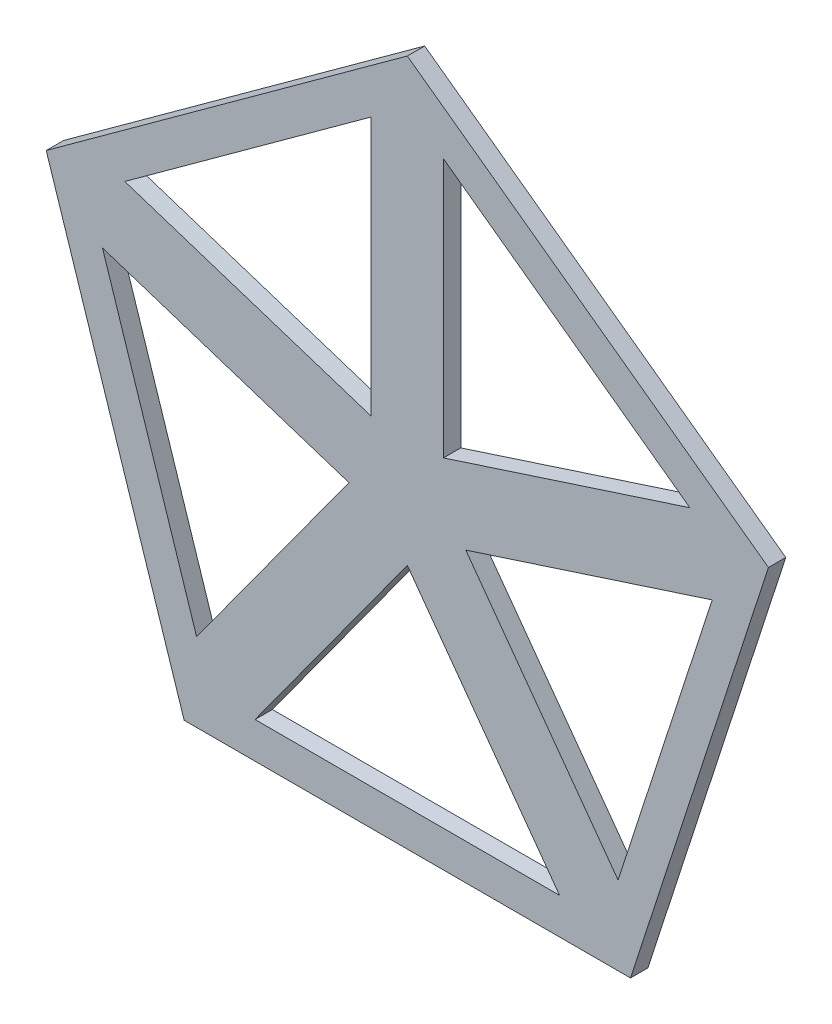
ISO-10303-21;
HEADER;
FILE_DESCRIPTION(('STEP AP214'),'2;1');
FILE_NAME('part.step','',(''),(''),'','','');
FILE_SCHEMA(('AUTOMOTIVE_DESIGN { 1 0 10303 214 1 1 1 1 }'));
ENDSEC;
DATA;
#1=APPLICATION_CONTEXT('core data for automotive mechanical design processes');
#2=APPLICATION_PROTOCOL_DEFINITION('international standard','automotive_design',2000,#1);
#3=PRODUCT_CONTEXT('',#1,'mechanical');
#4=PRODUCT('Part','Part','',(#3));
#5=PRODUCT_RELATED_PRODUCT_CATEGORY('part','',(#4));
#6=PRODUCT_DEFINITION_FORMATION('','',#4);
#7=PRODUCT_DEFINITION_CONTEXT('part definition',#1,'design');
#8=PRODUCT_DEFINITION('design','',#6,#7);
#9=PRODUCT_DEFINITION_SHAPE('','',#8);
#10=(LENGTH_UNIT() NAMED_UNIT(*) SI_UNIT(.MILLI.,.METRE.));
#11=(NAMED_UNIT(*) PLANE_ANGLE_UNIT() SI_UNIT($,.RADIAN.));
#12=(NAMED_UNIT(*) SI_UNIT($,.STERADIAN.) SOLID_ANGLE_UNIT());
#13=UNCERTAINTY_MEASURE_WITH_UNIT(LENGTH_MEASURE(1.E-05),#10,'distance_accuracy_value','');
#14=(GEOMETRIC_REPRESENTATION_CONTEXT(3) GLOBAL_UNCERTAINTY_ASSIGNED_CONTEXT((#13)) GLOBAL_UNIT_ASSIGNED_CONTEXT((#10,
#11,#12)) REPRESENTATION_CONTEXT('',''));
#15=CARTESIAN_POINT('',(0.,0.,0.));
#16=DIRECTION('',(0.,0.,1.));
#17=DIRECTION('',(1.,0.,0.));
#18=AXIS2_PLACEMENT_3D('',#15,#16,#17);
#19=CARTESIAN_POINT('',(0.,0.,1.2));
#20=DIRECTION('',(0.,0.,1.));
#21=DIRECTION('',(1.,0.,0.));
#22=AXIS2_PLACEMENT_3D('',#19,#20,#21);
#23=PLANE('',#22);
#24=DIRECTION('',(-0.587785252292471,-0.809016994374949,0.));
#25=VECTOR('',#24,1.);
#26=CARTESIAN_POINT('',(-10.5443234549845,-18.766270208801,1.2));
#27=LINE('',#26,#25);
#28=CARTESIAN_POINT('',(0.,-4.2532540417602,1.2));
#29=VERTEX_POINT('',#28);
#30=CARTESIAN_POINT('',(-10.5443234549845,-18.766270208801,1.2));
#31=VERTEX_POINT('',#30);
#32=EDGE_CURVE('E199',#29,#31,#27,.T.);
#33=ORIENTED_EDGE('',*,*,#32,.F.);
#34=DIRECTION('',(-0.587785252292474,0.809016994374946,0.));
#35=VECTOR('',#34,1.);
#36=CARTESIAN_POINT('',(10.5443234549845,-18.766270208801,1.2));
#37=LINE('',#36,#35);
#38=CARTESIAN_POINT('',(10.5443234549845,-18.766270208801,1.2));
#39=VERTEX_POINT('',#38);
#40=EDGE_CURVE('E197',#39,#29,#37,.T.);
#41=ORIENTED_EDGE('',*,*,#40,.F.);
#42=DIRECTION('',(1.,0.,0.));
#43=VECTOR('',#42,1.);
#44=CARTESIAN_POINT('',(-10.5443234549845,-18.766270208801,1.2));
#45=LINE('',#44,#43);
#46=EDGE_CURVE('E203',#31,#39,#45,.T.);
#47=ORIENTED_EDGE('',*,*,#46,.F.);
#48=EDGE_LOOP('',(#33,#41,#47));
#49=FACE_BOUND('',#48,.T.);
#50=DIRECTION('',(-0.951056516295154,0.309016994374946,0.));
#51=VECTOR('',#50,1.);
#52=CARTESIAN_POINT('',(-21.1061587104124,4.229151116235,1.2));
#53=LINE('',#52,#51);
#54=CARTESIAN_POINT('',(-4.04508497187473,-1.31432778029784,1.2));
#55=VERTEX_POINT('',#54);
#56=CARTESIAN_POINT('',(-21.1061587104124,4.22915111623499,1.2));
#57=VERTEX_POINT('',#56);
#58=EDGE_CURVE('E247',#55,#57,#53,.T.);
#59=ORIENTED_EDGE('',*,*,#58,.F.);
#60=DIRECTION('',(0.587785252292472,0.809016994374949,0.));
#61=VECTOR('',#60,1.);
#62=CARTESIAN_POINT('',(-14.5894084268592,-15.8273439473387,1.2));
#63=LINE('',#62,#61);
#64=CARTESIAN_POINT('',(-14.5894084268592,-15.8273439473387,1.2));
#65=VERTEX_POINT('',#64);
#66=EDGE_CURVE('E245',#65,#55,#63,.T.);
#67=ORIENTED_EDGE('',*,*,#66,.F.);
#68=DIRECTION('',(0.309016994374949,-0.951056516295153,0.));
#69=VECTOR('',#68,1.);
#70=CARTESIAN_POINT('',(-21.1061587104124,4.229151116235,1.2));
#71=LINE('',#70,#69);
#72=EDGE_CURVE('E251',#57,#65,#71,.T.);
#73=ORIENTED_EDGE('',*,*,#72,.F.);
#74=EDGE_LOOP('',(#59,#67,#73));
#75=FACE_BOUND('',#74,.T.);
#76=DIRECTION('',(-0.809016994374949,0.587785252292472,0.));
#77=VECTOR('',#76,1.);
#78=CARTESIAN_POINT('',(25.,8.1229924058227,1.2));
#79=LINE('',#78,#77);
#80=CARTESIAN_POINT('',(25.,8.1229924058227,1.2));
#81=VERTEX_POINT('',#80);
#82=CARTESIAN_POINT('',(0.,26.2865556059567,1.2));
#83=VERTEX_POINT('',#82);
#84=EDGE_CURVE('E293',#81,#83,#79,.T.);
#85=ORIENTED_EDGE('',*,*,#84,.T.);
#86=DIRECTION('',(-0.809016994374946,-0.587785252292474,0.));
#87=VECTOR('',#86,1.);
#88=CARTESIAN_POINT('',(0.,26.2865556059567,1.2));
#89=LINE('',#88,#87);
#90=CARTESIAN_POINT('',(-25.,8.12299240582262,1.2));
#91=VERTEX_POINT('',#90);
#92=EDGE_CURVE('E296',#83,#91,#89,.T.);
#93=ORIENTED_EDGE('',*,*,#92,.T.);
#94=DIRECTION('',(0.309016994374949,-0.951056516295153,0.));
#95=VECTOR('',#94,1.);
#96=CARTESIAN_POINT('',(-25.,8.12299240582262,1.2));
#97=LINE('',#96,#95);
#98=CARTESIAN_POINT('',(-15.4508497187473,-21.266270208801,1.2));
#99=VERTEX_POINT('',#98);
#100=EDGE_CURVE('E299',#91,#99,#97,.T.);
#101=ORIENTED_EDGE('',*,*,#100,.T.);
#102=DIRECTION('',(1.,0.,0.));
#103=VECTOR('',#102,1.);
#104=CARTESIAN_POINT('',(-15.4508497187473,-21.266270208801,1.2));
#105=LINE('',#104,#103);
#106=CARTESIAN_POINT('',(15.4508497187474,-21.266270208801,1.2));
#107=VERTEX_POINT('',#106);
#108=EDGE_CURVE('E301',#99,#107,#105,.T.);
#109=ORIENTED_EDGE('',*,*,#108,.T.);
#110=DIRECTION('',(0.309016994374946,0.951056516295154,0.));
#111=VECTOR('',#110,1.);
#112=CARTESIAN_POINT('',(15.4508497187474,-21.266270208801,1.2));
#113=LINE('',#112,#111);
#114=EDGE_CURVE('E303',#107,#81,#113,.T.);
#115=ORIENTED_EDGE('',*,*,#114,.T.);
#116=EDGE_LOOP('',(#85,#93,#101,#109,#115));
#117=FACE_BOUND('',#116,.T.);
#118=DIRECTION('',(-0.809016994374946,-0.587785252292474,0.));
#119=VECTOR('',#118,1.);
#120=CARTESIAN_POINT('',(-2.50000000000004,21.3800293421938,1.2));
#121=LINE('',#120,#119);
#122=CARTESIAN_POINT('',(-2.50000000000004,21.3800293421938,1.2));
#123=VERTEX_POINT('',#122);
#124=CARTESIAN_POINT('',(-19.5610737385376,8.98443369771077,1.2));
#125=VERTEX_POINT('',#124);
#126=EDGE_CURVE('E271',#123,#125,#121,.T.);
#127=ORIENTED_EDGE('',*,*,#126,.F.);
#128=DIRECTION('',(0.,1.,0.));
#129=VECTOR('',#128,1.);
#130=CARTESIAN_POINT('',(-2.50000000000004,21.3800293421938,1.2));
#131=LINE('',#130,#129);
#132=CARTESIAN_POINT('',(-2.50000000000004,3.44095480117794,1.2));
#133=VERTEX_POINT('',#132);
#134=EDGE_CURVE('E269',#133,#123,#131,.T.);
#135=ORIENTED_EDGE('',*,*,#134,.F.);
#136=DIRECTION('',(0.951056516295154,-0.309016994374946,0.));
#137=VECTOR('',#136,1.);
#138=CARTESIAN_POINT('',(-19.5610737385376,8.98443369771077,1.2));
#139=LINE('',#138,#137);
#140=EDGE_CURVE('E275',#125,#133,#139,.T.);
#141=ORIENTED_EDGE('',*,*,#140,.F.);
#142=EDGE_LOOP('',(#127,#135,#141));
#143=FACE_BOUND('',#142,.T.);
#144=DIRECTION('',(0.,-1.,0.));
#145=VECTOR('',#144,1.);
#146=CARTESIAN_POINT('',(2.49999999999995,21.3800293421938,1.2));
#147=LINE('',#146,#145);
#148=CARTESIAN_POINT('',(2.49999999999995,21.3800293421938,1.2));
#149=VERTEX_POINT('',#148);
#150=CARTESIAN_POINT('',(2.49999999999996,3.44095480117793,1.2));
#151=VERTEX_POINT('',#150);
#152=EDGE_CURVE('E223',#149,#151,#147,.T.);
#153=ORIENTED_EDGE('',*,*,#152,.F.);
#154=DIRECTION('',(-0.809016994374948,0.587785252292472,0.));
#155=VECTOR('',#154,1.);
#156=CARTESIAN_POINT('',(19.5610737385376,8.98443369771083,1.2));
#157=LINE('',#156,#155);
#158=CARTESIAN_POINT('',(19.5610737385376,8.98443369771083,1.2));
#159=VERTEX_POINT('',#158);
#160=EDGE_CURVE('E221',#159,#149,#157,.T.);
#161=ORIENTED_EDGE('',*,*,#160,.F.);
#162=DIRECTION('',(0.951056516295153,0.309016994374949,0.));
#163=VECTOR('',#162,1.);
#164=CARTESIAN_POINT('',(19.5610737385376,8.98443369771083,1.2));
#165=LINE('',#164,#163);
#166=EDGE_CURVE('E227',#151,#159,#165,.T.);
#167=ORIENTED_EDGE('',*,*,#166,.F.);
#168=EDGE_LOOP('',(#153,#161,#167));
#169=FACE_BOUND('',#168,.T.);
#170=DIRECTION('',(0.309016994374946,0.951056516295154,0.));
#171=VECTOR('',#170,1.);
#172=CARTESIAN_POINT('',(14.5894084268593,-15.8273439473386,1.2));
#173=LINE('',#172,#171);
#174=CARTESIAN_POINT('',(14.5894084268593,-15.8273439473386,1.2));
#175=VERTEX_POINT('',#174);
#176=CARTESIAN_POINT('',(21.1061587104124,4.22915111623507,1.2));
#177=VERTEX_POINT('',#176);
#178=EDGE_CURVE('E178',#175,#177,#173,.T.);
#179=ORIENTED_EDGE('',*,*,#178,.F.);
#180=DIRECTION('',(0.587785252292475,-0.809016994374946,0.));
#181=VECTOR('',#180,1.);
#182=CARTESIAN_POINT('',(14.5894084268593,-15.8273439473386,1.2));
#183=LINE('',#182,#181);
#184=CARTESIAN_POINT('',(4.04508497187474,-1.31432778029783,1.2));
#185=VERTEX_POINT('',#184);
#186=EDGE_CURVE('E170',#185,#175,#183,.T.);
#187=ORIENTED_EDGE('',*,*,#186,.F.);
#188=DIRECTION('',(-0.951056516295153,-0.309016994374949,0.));
#189=VECTOR('',#188,1.);
#190=CARTESIAN_POINT('',(21.1061587104124,4.22915111623507,1.2));
#191=LINE('',#190,#189);
#192=EDGE_CURVE('E187',#177,#185,#191,.T.);
#193=ORIENTED_EDGE('',*,*,#192,.F.);
#194=EDGE_LOOP('',(#179,#187,#193));
#195=FACE_BOUND('',#194,.T.);
#196=ADVANCED_FACE('F33',(#49,#75,#117,#143,#169,#195),#23,.T.);
#197=CARTESIAN_POINT('',(0.,0.,0.));
#198=DIRECTION('',(0.,0.,1.));
#199=DIRECTION('',(1.,0.,0.));
#200=AXIS2_PLACEMENT_3D('',#197,#198,#199);
#201=PLANE('',#200);
#202=DIRECTION('',(-0.587785252292474,0.809016994374946,0.));
#203=VECTOR('',#202,1.);
#204=CARTESIAN_POINT('',(10.5443234549845,-18.766270208801,0.));
#205=LINE('',#204,#203);
#206=CARTESIAN_POINT('',(10.5443234549845,-18.766270208801,0.));
#207=VERTEX_POINT('',#206);
#208=CARTESIAN_POINT('',(0.,-4.2532540417602,0.));
#209=VERTEX_POINT('',#208);
#210=EDGE_CURVE('E185',#207,#209,#205,.T.);
#211=ORIENTED_EDGE('',*,*,#210,.T.);
#212=DIRECTION('',(-0.587785252292471,-0.809016994374949,0.));
#213=VECTOR('',#212,1.);
#214=CARTESIAN_POINT('',(-10.5443234549845,-18.766270208801,0.));
#215=LINE('',#214,#213);
#216=CARTESIAN_POINT('',(-10.5443234549845,-18.766270208801,0.));
#217=VERTEX_POINT('',#216);
#218=EDGE_CURVE('E208',#209,#217,#215,.T.);
#219=ORIENTED_EDGE('',*,*,#218,.T.);
#220=DIRECTION('',(1.,0.,0.));
#221=VECTOR('',#220,1.);
#222=CARTESIAN_POINT('',(-10.5443234549845,-18.766270208801,0.));
#223=LINE('',#222,#221);
#224=EDGE_CURVE('E200',#217,#207,#223,.T.);
#225=ORIENTED_EDGE('',*,*,#224,.T.);
#226=EDGE_LOOP('',(#211,#219,#225));
#227=FACE_BOUND('',#226,.T.);
#228=DIRECTION('',(0.587785252292472,0.809016994374949,0.));
#229=VECTOR('',#228,1.);
#230=CARTESIAN_POINT('',(-14.5894084268592,-15.8273439473387,0.));
#231=LINE('',#230,#229);
#232=CARTESIAN_POINT('',(-14.5894084268592,-15.8273439473387,0.));
#233=VERTEX_POINT('',#232);
#234=CARTESIAN_POINT('',(-4.04508497187473,-1.31432778029784,0.));
#235=VERTEX_POINT('',#234);
#236=EDGE_CURVE('E244',#233,#235,#231,.T.);
#237=ORIENTED_EDGE('',*,*,#236,.T.);
#238=DIRECTION('',(-0.951056516295154,0.309016994374946,0.));
#239=VECTOR('',#238,1.);
#240=CARTESIAN_POINT('',(-21.1061587104124,4.229151116235,0.));
#241=LINE('',#240,#239);
#242=CARTESIAN_POINT('',(-21.1061587104124,4.229151116235,0.));
#243=VERTEX_POINT('',#242);
#244=EDGE_CURVE('E256',#235,#243,#241,.T.);
#245=ORIENTED_EDGE('',*,*,#244,.T.);
#246=DIRECTION('',(0.309016994374949,-0.951056516295153,0.));
#247=VECTOR('',#246,1.);
#248=CARTESIAN_POINT('',(-21.1061587104124,4.229151116235,0.));
#249=LINE('',#248,#247);
#250=EDGE_CURVE('E248',#243,#233,#249,.T.);
#251=ORIENTED_EDGE('',*,*,#250,.T.);
#252=EDGE_LOOP('',(#237,#245,#251));
#253=FACE_BOUND('',#252,.T.);
#254=DIRECTION('',(-0.809016994374949,0.587785252292472,0.));
#255=VECTOR('',#254,1.);
#256=CARTESIAN_POINT('',(25.,8.1229924058227,0.));
#257=LINE('',#256,#255);
#258=CARTESIAN_POINT('',(25.,8.1229924058227,0.));
#259=VERTEX_POINT('',#258);
#260=CARTESIAN_POINT('',(0.,26.2865556059567,0.));
#261=VERTEX_POINT('',#260);
#262=EDGE_CURVE('E292',#259,#261,#257,.T.);
#263=ORIENTED_EDGE('',*,*,#262,.F.);
#264=DIRECTION('',(0.309016994374946,0.951056516295154,0.));
#265=VECTOR('',#264,1.);
#266=CARTESIAN_POINT('',(15.4508497187474,-21.266270208801,0.));
#267=LINE('',#266,#265);
#268=CARTESIAN_POINT('',(15.4508497187474,-21.266270208801,0.));
#269=VERTEX_POINT('',#268);
#270=EDGE_CURVE('E297',#269,#259,#267,.T.);
#271=ORIENTED_EDGE('',*,*,#270,.F.);
#272=DIRECTION('',(1.,0.,0.));
#273=VECTOR('',#272,1.);
#274=CARTESIAN_POINT('',(-15.4508497187473,-21.266270208801,0.));
#275=LINE('',#274,#273);
#276=CARTESIAN_POINT('',(-15.4508497187473,-21.266270208801,0.));
#277=VERTEX_POINT('',#276);
#278=EDGE_CURVE('E312',#277,#269,#275,.T.);
#279=ORIENTED_EDGE('',*,*,#278,.F.);
#280=DIRECTION('',(0.309016994374949,-0.951056516295153,0.));
#281=VECTOR('',#280,1.);
#282=CARTESIAN_POINT('',(-25.,8.12299240582262,0.));
#283=LINE('',#282,#281);
#284=CARTESIAN_POINT('',(-25.,8.12299240582262,0.));
#285=VERTEX_POINT('',#284);
#286=EDGE_CURVE('E310',#285,#277,#283,.T.);
#287=ORIENTED_EDGE('',*,*,#286,.F.);
#288=DIRECTION('',(-0.809016994374946,-0.587785252292474,0.));
#289=VECTOR('',#288,1.);
#290=CARTESIAN_POINT('',(0.,26.2865556059567,0.));
#291=LINE('',#290,#289);
#292=EDGE_CURVE('E308',#261,#285,#291,.T.);
#293=ORIENTED_EDGE('',*,*,#292,.F.);
#294=EDGE_LOOP('',(#263,#271,#279,#287,#293));
#295=FACE_BOUND('',#294,.T.);
#296=DIRECTION('',(0.,1.,0.));
#297=VECTOR('',#296,1.);
#298=CARTESIAN_POINT('',(-2.50000000000004,21.3800293421938,0.));
#299=LINE('',#298,#297);
#300=CARTESIAN_POINT('',(-2.50000000000004,3.44095480117795,0.));
#301=VERTEX_POINT('',#300);
#302=CARTESIAN_POINT('',(-2.50000000000004,21.3800293421938,0.));
#303=VERTEX_POINT('',#302);
#304=EDGE_CURVE('E268',#301,#303,#299,.T.);
#305=ORIENTED_EDGE('',*,*,#304,.T.);
#306=DIRECTION('',(-0.809016994374946,-0.587785252292474,0.));
#307=VECTOR('',#306,1.);
#308=CARTESIAN_POINT('',(-2.50000000000004,21.3800293421938,0.));
#309=LINE('',#308,#307);
#310=CARTESIAN_POINT('',(-19.5610737385376,8.98443369771077,0.));
#311=VERTEX_POINT('',#310);
#312=EDGE_CURVE('E280',#303,#311,#309,.T.);
#313=ORIENTED_EDGE('',*,*,#312,.T.);
#314=DIRECTION('',(0.951056516295154,-0.309016994374946,0.));
#315=VECTOR('',#314,1.);
#316=CARTESIAN_POINT('',(-19.5610737385376,8.98443369771077,0.));
#317=LINE('',#316,#315);
#318=EDGE_CURVE('E272',#311,#301,#317,.T.);
#319=ORIENTED_EDGE('',*,*,#318,.T.);
#320=EDGE_LOOP('',(#305,#313,#319));
#321=FACE_BOUND('',#320,.T.);
#322=DIRECTION('',(-0.809016994374948,0.587785252292472,0.));
#323=VECTOR('',#322,1.);
#324=CARTESIAN_POINT('',(19.5610737385376,8.98443369771083,0.));
#325=LINE('',#324,#323);
#326=CARTESIAN_POINT('',(19.5610737385376,8.98443369771083,0.));
#327=VERTEX_POINT('',#326);
#328=CARTESIAN_POINT('',(2.49999999999995,21.3800293421938,0.));
#329=VERTEX_POINT('',#328);
#330=EDGE_CURVE('E220',#327,#329,#325,.T.);
#331=ORIENTED_EDGE('',*,*,#330,.T.);
#332=DIRECTION('',(0.,-1.,0.));
#333=VECTOR('',#332,1.);
#334=CARTESIAN_POINT('',(2.49999999999995,21.3800293421938,0.));
#335=LINE('',#334,#333);
#336=CARTESIAN_POINT('',(2.49999999999996,3.44095480117792,0.));
#337=VERTEX_POINT('',#336);
#338=EDGE_CURVE('E232',#329,#337,#335,.T.);
#339=ORIENTED_EDGE('',*,*,#338,.T.);
#340=DIRECTION('',(0.951056516295153,0.309016994374949,0.));
#341=VECTOR('',#340,1.);
#342=CARTESIAN_POINT('',(19.5610737385376,8.98443369771083,0.));
#343=LINE('',#342,#341);
#344=EDGE_CURVE('E224',#337,#327,#343,.T.);
#345=ORIENTED_EDGE('',*,*,#344,.T.);
#346=EDGE_LOOP('',(#331,#339,#345));
#347=FACE_BOUND('',#346,.T.);
#348=DIRECTION('',(0.587785252292475,-0.809016994374946,0.));
#349=VECTOR('',#348,1.);
#350=CARTESIAN_POINT('',(14.5894084268593,-15.8273439473386,0.));
#351=LINE('',#350,#349);
#352=CARTESIAN_POINT('',(4.04508497187474,-1.31432778029783,0.));
#353=VERTEX_POINT('',#352);
#354=CARTESIAN_POINT('',(14.5894084268593,-15.8273439473386,0.));
#355=VERTEX_POINT('',#354);
#356=EDGE_CURVE('E56',#353,#355,#351,.T.);
#357=ORIENTED_EDGE('',*,*,#356,.T.);
#358=DIRECTION('',(0.309016994374946,0.951056516295154,0.));
#359=VECTOR('',#358,1.);
#360=CARTESIAN_POINT('',(14.5894084268593,-15.8273439473386,0.));
#361=LINE('',#360,#359);
#362=CARTESIAN_POINT('',(21.1061587104124,4.22915111623507,0.));
#363=VERTEX_POINT('',#362);
#364=EDGE_CURVE('E184',#355,#363,#361,.T.);
#365=ORIENTED_EDGE('',*,*,#364,.T.);
#366=DIRECTION('',(-0.951056516295153,-0.309016994374949,0.));
#367=VECTOR('',#366,1.);
#368=CARTESIAN_POINT('',(21.1061587104124,4.22915111623507,0.));
#369=LINE('',#368,#367);
#370=EDGE_CURVE('E179',#363,#353,#369,.T.);
#371=ORIENTED_EDGE('',*,*,#370,.T.);
#372=EDGE_LOOP('',(#357,#365,#371));
#373=FACE_BOUND('',#372,.T.);
#374=ADVANCED_FACE('F333',(#227,#253,#295,#321,#347,#373),#201,.F.);
#375=CARTESIAN_POINT('',(25.,8.1229924058227,1.2));
#376=DIRECTION('',(-0.587785252292472,-0.809016994374949,0.));
#377=DIRECTION('',(0.809016994374949,-0.587785252292472,0.));
#378=AXIS2_PLACEMENT_3D('',#375,#376,#377);
#379=PLANE('',#378);
#380=ORIENTED_EDGE('',*,*,#262,.T.);
#381=DIRECTION('',(0.,0.,-1.));
#382=VECTOR('',#381,1.);
#383=CARTESIAN_POINT('',(0.,26.2865556059567,1.2));
#384=LINE('',#383,#382);
#385=EDGE_CURVE('E11',#83,#261,#384,.T.);
#386=ORIENTED_EDGE('',*,*,#385,.F.);
#387=ORIENTED_EDGE('',*,*,#84,.F.);
#388=DIRECTION('',(0.,0.,-1.));
#389=VECTOR('',#388,1.);
#390=CARTESIAN_POINT('',(25.,8.1229924058227,1.2));
#391=LINE('',#390,#389);
#392=EDGE_CURVE('E305',#81,#259,#391,.T.);
#393=ORIENTED_EDGE('',*,*,#392,.T.);
#394=EDGE_LOOP('',(#380,#386,#387,#393));
#395=FACE_BOUND('',#394,.T.);
#396=ADVANCED_FACE('F35',(#395),#379,.F.);
#397=CARTESIAN_POINT('',(0.,26.2865556059567,1.2));
#398=DIRECTION('',(0.587785252292474,-0.809016994374947,0.));
#399=DIRECTION('',(0.809016994374947,0.587785252292474,0.));
#400=AXIS2_PLACEMENT_3D('',#397,#398,#399);
#401=PLANE('',#400);
#402=ORIENTED_EDGE('',*,*,#292,.T.);
#403=DIRECTION('',(0.,0.,-1.));
#404=VECTOR('',#403,1.);
#405=CARTESIAN_POINT('',(-25.,8.12299240582262,1.2));
#406=LINE('',#405,#404);
#407=EDGE_CURVE('E41',#91,#285,#406,.T.);
#408=ORIENTED_EDGE('',*,*,#407,.F.);
#409=ORIENTED_EDGE('',*,*,#92,.F.);
#410=ORIENTED_EDGE('',*,*,#385,.T.);
#411=EDGE_LOOP('',(#402,#408,#409,#410));
#412=FACE_BOUND('',#411,.T.);
#413=ADVANCED_FACE('F348',(#412),#401,.F.);
#414=CARTESIAN_POINT('',(-25.,8.12299240582262,1.2));
#415=DIRECTION('',(0.951056516295153,0.309016994374949,0.));
#416=DIRECTION('',(-0.309016994374949,0.951056516295153,0.));
#417=AXIS2_PLACEMENT_3D('',#414,#415,#416);
#418=PLANE('',#417);
#419=ORIENTED_EDGE('',*,*,#286,.T.);
#420=DIRECTION('',(0.,0.,-1.));
#421=VECTOR('',#420,1.);
#422=CARTESIAN_POINT('',(-15.4508497187473,-21.266270208801,1.2));
#423=LINE('',#422,#421);
#424=EDGE_CURVE('E320',#99,#277,#423,.T.);
#425=ORIENTED_EDGE('',*,*,#424,.F.);
#426=ORIENTED_EDGE('',*,*,#100,.F.);
#427=ORIENTED_EDGE('',*,*,#407,.T.);
#428=EDGE_LOOP('',(#419,#425,#426,#427));
#429=FACE_BOUND('',#428,.T.);
#430=ADVANCED_FACE('F327',(#429),#418,.F.);
#431=CARTESIAN_POINT('',(-15.4508497187473,-21.266270208801,1.2));
#432=DIRECTION('',(0.,1.,0.));
#433=DIRECTION('',(-1.,0.,0.));
#434=AXIS2_PLACEMENT_3D('',#431,#432,#433);
#435=PLANE('',#434);
#436=ORIENTED_EDGE('',*,*,#278,.T.);
#437=DIRECTION('',(0.,0.,-1.));
#438=VECTOR('',#437,1.);
#439=CARTESIAN_POINT('',(15.4508497187474,-21.266270208801,1.2));
#440=LINE('',#439,#438);
#441=EDGE_CURVE('E317',#107,#269,#440,.T.);
#442=ORIENTED_EDGE('',*,*,#441,.F.);
#443=ORIENTED_EDGE('',*,*,#108,.F.);
#444=ORIENTED_EDGE('',*,*,#424,.T.);
#445=EDGE_LOOP('',(#436,#442,#443,#444));
#446=FACE_BOUND('',#445,.T.);
#447=ADVANCED_FACE('F338',(#446),#435,.F.);
#448=CARTESIAN_POINT('',(15.4508497187474,-21.266270208801,1.2));
#449=DIRECTION('',(-0.951056516295154,0.309016994374946,0.));
#450=DIRECTION('',(-0.309016994374946,-0.951056516295154,0.));
#451=AXIS2_PLACEMENT_3D('',#448,#449,#450);
#452=PLANE('',#451);
#453=ORIENTED_EDGE('',*,*,#270,.T.);
#454=ORIENTED_EDGE('',*,*,#392,.F.);
#455=ORIENTED_EDGE('',*,*,#114,.F.);
#456=ORIENTED_EDGE('',*,*,#441,.T.);
#457=EDGE_LOOP('',(#453,#454,#455,#456));
#458=FACE_BOUND('',#457,.T.);
#459=ADVANCED_FACE('F342',(#458),#452,.F.);
#460=CARTESIAN_POINT('',(-2.50000000000004,21.3800293421938,1.2));
#461=DIRECTION('',(-1.,0.,0.));
#462=DIRECTION('',(0.,-1.,0.));
#463=AXIS2_PLACEMENT_3D('',#460,#461,#462);
#464=PLANE('',#463);
#465=ORIENTED_EDGE('',*,*,#304,.F.);
#466=DIRECTION('',(0.,0.,-1.));
#467=VECTOR('',#466,1.);
#468=CARTESIAN_POINT('',(-2.50000000000004,3.44095480117794,1.2));
#469=LINE('',#468,#467);
#470=EDGE_CURVE('E277',#133,#301,#469,.T.);
#471=ORIENTED_EDGE('',*,*,#470,.F.);
#472=ORIENTED_EDGE('',*,*,#134,.T.);
#473=DIRECTION('',(0.,0.,-1.));
#474=VECTOR('',#473,1.);
#475=CARTESIAN_POINT('',(-2.50000000000004,21.3800293421938,1.2));
#476=LINE('',#475,#474);
#477=EDGE_CURVE('E289',#123,#303,#476,.T.);
#478=ORIENTED_EDGE('',*,*,#477,.T.);
#479=EDGE_LOOP('',(#465,#471,#472,#478));
#480=FACE_BOUND('',#479,.T.);
#481=ADVANCED_FACE('F365',(#480),#464,.T.);
#482=CARTESIAN_POINT('',(-2.50000000000004,21.3800293421938,1.2));
#483=DIRECTION('',(0.587785252292474,-0.809016994374946,0.));
#484=DIRECTION('',(0.809016994374947,0.587785252292475,0.));
#485=AXIS2_PLACEMENT_3D('',#482,#483,#484);
#486=PLANE('',#485);
#487=ORIENTED_EDGE('',*,*,#312,.F.);
#488=ORIENTED_EDGE('',*,*,#477,.F.);
#489=ORIENTED_EDGE('',*,*,#126,.T.);
#490=DIRECTION('',(0.,0.,-1.));
#491=VECTOR('',#490,1.);
#492=CARTESIAN_POINT('',(-19.5610737385376,8.98443369771077,1.2));
#493=LINE('',#492,#491);
#494=EDGE_CURVE('E287',#125,#311,#493,.T.);
#495=ORIENTED_EDGE('',*,*,#494,.T.);
#496=EDGE_LOOP('',(#487,#488,#489,#495));
#497=FACE_BOUND('',#496,.T.);
#498=ADVANCED_FACE('F391',(#497),#486,.T.);
#499=CARTESIAN_POINT('',(-19.5610737385376,8.98443369771077,1.2));
#500=DIRECTION('',(0.309016994374946,0.951056516295154,0.));
#501=DIRECTION('',(-0.951056516295154,0.309016994374946,0.));
#502=AXIS2_PLACEMENT_3D('',#499,#500,#501);
#503=PLANE('',#502);
#504=ORIENTED_EDGE('',*,*,#318,.F.);
#505=ORIENTED_EDGE('',*,*,#494,.F.);
#506=ORIENTED_EDGE('',*,*,#140,.T.);
#507=ORIENTED_EDGE('',*,*,#470,.T.);
#508=EDGE_LOOP('',(#504,#505,#506,#507));
#509=FACE_BOUND('',#508,.T.);
#510=ADVANCED_FACE('F398',(#509),#503,.T.);
#511=CARTESIAN_POINT('',(-14.5894084268592,-15.8273439473387,1.2));
#512=DIRECTION('',(-0.809016994374949,0.587785252292472,0.));
#513=DIRECTION('',(-0.587785252292472,-0.809016994374949,0.));
#514=AXIS2_PLACEMENT_3D('',#511,#512,#513);
#515=PLANE('',#514);
#516=ORIENTED_EDGE('',*,*,#236,.F.);
#517=DIRECTION('',(0.,0.,-1.));
#518=VECTOR('',#517,1.);
#519=CARTESIAN_POINT('',(-14.5894084268592,-15.8273439473387,1.2));
#520=LINE('',#519,#518);
#521=EDGE_CURVE('E253',#65,#233,#520,.T.);
#522=ORIENTED_EDGE('',*,*,#521,.F.);
#523=ORIENTED_EDGE('',*,*,#66,.T.);
#524=DIRECTION('',(0.,0.,-1.));
#525=VECTOR('',#524,1.);
#526=CARTESIAN_POINT('',(-4.04508497187473,-1.31432778029784,1.2));
#527=LINE('',#526,#525);
#528=EDGE_CURVE('E265',#55,#235,#527,.T.);
#529=ORIENTED_EDGE('',*,*,#528,.T.);
#530=EDGE_LOOP('',(#516,#522,#523,#529));
#531=FACE_BOUND('',#530,.T.);
#532=ADVANCED_FACE('F405',(#531),#515,.T.);
#533=CARTESIAN_POINT('',(-21.1061587104124,4.229151116235,1.2));
#534=DIRECTION('',(-0.309016994374946,-0.951056516295154,0.));
#535=DIRECTION('',(0.951056516295154,-0.309016994374946,0.));
#536=AXIS2_PLACEMENT_3D('',#533,#534,#535);
#537=PLANE('',#536);
#538=ORIENTED_EDGE('',*,*,#244,.F.);
#539=ORIENTED_EDGE('',*,*,#528,.F.);
#540=ORIENTED_EDGE('',*,*,#58,.T.);
#541=DIRECTION('',(0.,0.,-1.));
#542=VECTOR('',#541,1.);
#543=CARTESIAN_POINT('',(-21.1061587104124,4.229151116235,1.2));
#544=LINE('',#543,#542);
#545=EDGE_CURVE('E263',#57,#243,#544,.T.);
#546=ORIENTED_EDGE('',*,*,#545,.T.);
#547=EDGE_LOOP('',(#538,#539,#540,#546));
#548=FACE_BOUND('',#547,.T.);
#549=ADVANCED_FACE('F413',(#548),#537,.T.);
#550=CARTESIAN_POINT('',(-21.1061587104124,4.229151116235,1.2));
#551=DIRECTION('',(0.951056516295153,0.309016994374949,0.));
#552=DIRECTION('',(-0.309016994374949,0.951056516295153,0.));
#553=AXIS2_PLACEMENT_3D('',#550,#551,#552);
#554=PLANE('',#553);
#555=ORIENTED_EDGE('',*,*,#250,.F.);
#556=ORIENTED_EDGE('',*,*,#545,.F.);
#557=ORIENTED_EDGE('',*,*,#72,.T.);
#558=ORIENTED_EDGE('',*,*,#521,.T.);
#559=EDGE_LOOP('',(#555,#556,#557,#558));
#560=FACE_BOUND('',#559,.T.);
#561=ADVANCED_FACE('F421',(#560),#554,.T.);
#562=CARTESIAN_POINT('',(19.5610737385376,8.98443369771083,1.2));
#563=DIRECTION('',(-0.587785252292472,-0.809016994374948,0.));
#564=DIRECTION('',(0.809016994374948,-0.587785252292472,0.));
#565=AXIS2_PLACEMENT_3D('',#562,#563,#564);
#566=PLANE('',#565);
#567=ORIENTED_EDGE('',*,*,#330,.F.);
#568=DIRECTION('',(0.,0.,-1.));
#569=VECTOR('',#568,1.);
#570=CARTESIAN_POINT('',(19.5610737385376,8.98443369771083,1.2));
#571=LINE('',#570,#569);
#572=EDGE_CURVE('E229',#159,#327,#571,.T.);
#573=ORIENTED_EDGE('',*,*,#572,.F.);
#574=ORIENTED_EDGE('',*,*,#160,.T.);
#575=DIRECTION('',(0.,0.,-1.));
#576=VECTOR('',#575,1.);
#577=CARTESIAN_POINT('',(2.49999999999995,21.3800293421938,1.2));
#578=LINE('',#577,#576);
#579=EDGE_CURVE('E241',#149,#329,#578,.T.);
#580=ORIENTED_EDGE('',*,*,#579,.T.);
#581=EDGE_LOOP('',(#567,#573,#574,#580));
#582=FACE_BOUND('',#581,.T.);
#583=ADVANCED_FACE('F429',(#582),#566,.T.);
#584=CARTESIAN_POINT('',(2.49999999999995,21.3800293421938,1.2));
#585=DIRECTION('',(1.,0.,0.));
#586=DIRECTION('',(0.,1.,0.));
#587=AXIS2_PLACEMENT_3D('',#584,#585,#586);
#588=PLANE('',#587);
#589=ORIENTED_EDGE('',*,*,#338,.F.);
#590=ORIENTED_EDGE('',*,*,#579,.F.);
#591=ORIENTED_EDGE('',*,*,#152,.T.);
#592=DIRECTION('',(0.,0.,-1.));
#593=VECTOR('',#592,1.);
#594=CARTESIAN_POINT('',(2.49999999999996,3.44095480117792,1.2));
#595=LINE('',#594,#593);
#596=EDGE_CURVE('E239',#151,#337,#595,.T.);
#597=ORIENTED_EDGE('',*,*,#596,.T.);
#598=EDGE_LOOP('',(#589,#590,#591,#597));
#599=FACE_BOUND('',#598,.T.);
#600=ADVANCED_FACE('F437',(#599),#588,.T.);
#601=CARTESIAN_POINT('',(19.5610737385376,8.98443369771083,1.2));
#602=DIRECTION('',(-0.309016994374949,0.951056516295153,0.));
#603=DIRECTION('',(-0.951056516295153,-0.309016994374949,0.));
#604=AXIS2_PLACEMENT_3D('',#601,#602,#603);
#605=PLANE('',#604);
#606=ORIENTED_EDGE('',*,*,#344,.F.);
#607=ORIENTED_EDGE('',*,*,#596,.F.);
#608=ORIENTED_EDGE('',*,*,#166,.T.);
#609=ORIENTED_EDGE('',*,*,#572,.T.);
#610=EDGE_LOOP('',(#606,#607,#608,#609));
#611=FACE_BOUND('',#610,.T.);
#612=ADVANCED_FACE('F445',(#611),#605,.T.);
#613=CARTESIAN_POINT('',(10.5443234549845,-18.766270208801,1.2));
#614=DIRECTION('',(-0.809016994374946,-0.587785252292474,0.));
#615=DIRECTION('',(0.587785252292475,-0.809016994374947,0.));
#616=AXIS2_PLACEMENT_3D('',#613,#614,#615);
#617=PLANE('',#616);
#618=ORIENTED_EDGE('',*,*,#210,.F.);
#619=DIRECTION('',(0.,0.,-1.));
#620=VECTOR('',#619,1.);
#621=CARTESIAN_POINT('',(10.5443234549845,-18.766270208801,1.2));
#622=LINE('',#621,#620);
#623=EDGE_CURVE('E205',#39,#207,#622,.T.);
#624=ORIENTED_EDGE('',*,*,#623,.F.);
#625=ORIENTED_EDGE('',*,*,#40,.T.);
#626=DIRECTION('',(0.,0.,-1.));
#627=VECTOR('',#626,1.);
#628=CARTESIAN_POINT('',(0.,-4.2532540417602,1.2));
#629=LINE('',#628,#627);
#630=EDGE_CURVE('E217',#29,#209,#629,.T.);
#631=ORIENTED_EDGE('',*,*,#630,.T.);
#632=EDGE_LOOP('',(#618,#624,#625,#631));
#633=FACE_BOUND('',#632,.T.);
#634=ADVANCED_FACE('F453',(#633),#617,.T.);
#635=CARTESIAN_POINT('',(-10.5443234549845,-18.766270208801,1.2));
#636=DIRECTION('',(0.809016994374949,-0.587785252292471,0.));
#637=DIRECTION('',(0.587785252292471,0.809016994374949,0.));
#638=AXIS2_PLACEMENT_3D('',#635,#636,#637);
#639=PLANE('',#638);
#640=ORIENTED_EDGE('',*,*,#218,.F.);
#641=ORIENTED_EDGE('',*,*,#630,.F.);
#642=ORIENTED_EDGE('',*,*,#32,.T.);
#643=DIRECTION('',(0.,0.,-1.));
#644=VECTOR('',#643,1.);
#645=CARTESIAN_POINT('',(-10.5443234549845,-18.766270208801,1.2));
#646=LINE('',#645,#644);
#647=EDGE_CURVE('E215',#31,#217,#646,.T.);
#648=ORIENTED_EDGE('',*,*,#647,.T.);
#649=EDGE_LOOP('',(#640,#641,#642,#648));
#650=FACE_BOUND('',#649,.T.);
#651=ADVANCED_FACE('F461',(#650),#639,.T.);
#652=CARTESIAN_POINT('',(-10.5443234549845,-18.766270208801,1.2));
#653=DIRECTION('',(0.,1.,0.));
#654=DIRECTION('',(-1.,0.,0.));
#655=AXIS2_PLACEMENT_3D('',#652,#653,#654);
#656=PLANE('',#655);
#657=ORIENTED_EDGE('',*,*,#224,.F.);
#658=ORIENTED_EDGE('',*,*,#647,.F.);
#659=ORIENTED_EDGE('',*,*,#46,.T.);
#660=ORIENTED_EDGE('',*,*,#623,.T.);
#661=EDGE_LOOP('',(#657,#658,#659,#660));
#662=FACE_BOUND('',#661,.T.);
#663=ADVANCED_FACE('F469',(#662),#656,.T.);
#664=CARTESIAN_POINT('',(14.5894084268593,-15.8273439473386,1.2));
#665=DIRECTION('',(0.809016994374946,0.587785252292475,0.));
#666=DIRECTION('',(-0.587785252292475,0.809016994374946,0.));
#667=AXIS2_PLACEMENT_3D('',#664,#665,#666);
#668=PLANE('',#667);
#669=ORIENTED_EDGE('',*,*,#356,.F.);
#670=DIRECTION('',(0.,0.,-1.));
#671=VECTOR('',#670,1.);
#672=CARTESIAN_POINT('',(4.04508497187474,-1.31432778029783,1.2));
#673=LINE('',#672,#671);
#674=EDGE_CURVE('E174',#185,#353,#673,.T.);
#675=ORIENTED_EDGE('',*,*,#674,.F.);
#676=ORIENTED_EDGE('',*,*,#186,.T.);
#677=DIRECTION('',(0.,0.,-1.));
#678=VECTOR('',#677,1.);
#679=CARTESIAN_POINT('',(14.5894084268593,-15.8273439473386,1.2));
#680=LINE('',#679,#678);
#681=EDGE_CURVE('E173',#175,#355,#680,.T.);
#682=ORIENTED_EDGE('',*,*,#681,.T.);
#683=EDGE_LOOP('',(#669,#675,#676,#682));
#684=FACE_BOUND('',#683,.T.);
#685=ADVANCED_FACE('F172',(#684),#668,.T.);
#686=CARTESIAN_POINT('',(14.5894084268593,-15.8273439473386,1.2));
#687=DIRECTION('',(-0.951056516295154,0.309016994374946,0.));
#688=DIRECTION('',(-0.309016994374946,-0.951056516295154,0.));
#689=AXIS2_PLACEMENT_3D('',#686,#687,#688);
#690=PLANE('',#689);
#691=ORIENTED_EDGE('',*,*,#364,.F.);
#692=ORIENTED_EDGE('',*,*,#681,.F.);
#693=ORIENTED_EDGE('',*,*,#178,.T.);
#694=DIRECTION('',(0.,0.,-1.));
#695=VECTOR('',#694,1.);
#696=CARTESIAN_POINT('',(21.1061587104124,4.22915111623507,1.2));
#697=LINE('',#696,#695);
#698=EDGE_CURVE('E48',#177,#363,#697,.T.);
#699=ORIENTED_EDGE('',*,*,#698,.T.);
#700=EDGE_LOOP('',(#691,#692,#693,#699));
#701=FACE_BOUND('',#700,.T.);
#702=ADVANCED_FACE('F182',(#701),#690,.T.);
#703=CARTESIAN_POINT('',(21.1061587104124,4.22915111623507,1.2));
#704=DIRECTION('',(0.309016994374949,-0.951056516295153,0.));
#705=DIRECTION('',(0.951056516295153,0.309016994374949,0.));
#706=AXIS2_PLACEMENT_3D('',#703,#704,#705);
#707=PLANE('',#706);
#708=ORIENTED_EDGE('',*,*,#370,.F.);
#709=ORIENTED_EDGE('',*,*,#698,.F.);
#710=ORIENTED_EDGE('',*,*,#192,.T.);
#711=ORIENTED_EDGE('',*,*,#674,.T.);
#712=EDGE_LOOP('',(#708,#709,#710,#711));
#713=FACE_BOUND('',#712,.T.);
#714=ADVANCED_FACE('F490',(#713),#707,.T.);
#715=CLOSED_SHELL('',(#196,#374,#396,#413,#430,#447,#459,#481,#498,#510,#532,#549,#561,#583,
#600,#612,#634,#651,#663,#685,#702,#714));
#716=MANIFOLD_SOLID_BREP('B2',#715);
#717=ADVANCED_BREP_SHAPE_REPRESENTATION('',(#18,#716),#14);
#718=SHAPE_DEFINITION_REPRESENTATION(#9,#717);
ENDSEC;
END-ISO-10303-21;
